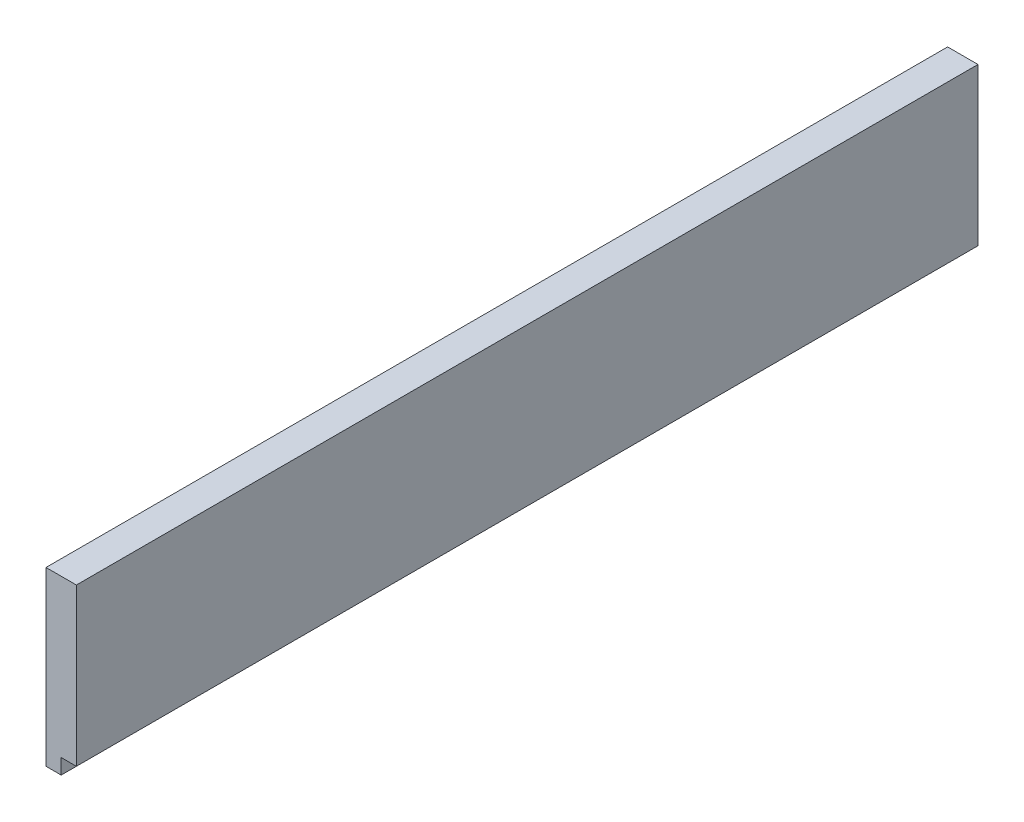
ISO-10303-21;
HEADER;
FILE_DESCRIPTION(('STEP AP214'),'2;1');
FILE_NAME('part.step','',(''),(''),'','','');
FILE_SCHEMA(('AUTOMOTIVE_DESIGN { 1 0 10303 214 1 1 1 1 }'));
ENDSEC;
DATA;
#1=APPLICATION_CONTEXT('core data for automotive mechanical design processes');
#2=APPLICATION_PROTOCOL_DEFINITION('international standard','automotive_design',2000,#1);
#3=PRODUCT_CONTEXT('',#1,'mechanical');
#4=PRODUCT('Part','Part','',(#3));
#5=PRODUCT_RELATED_PRODUCT_CATEGORY('part','',(#4));
#6=PRODUCT_DEFINITION_FORMATION('','',#4);
#7=PRODUCT_DEFINITION_CONTEXT('part definition',#1,'design');
#8=PRODUCT_DEFINITION('design','',#6,#7);
#9=PRODUCT_DEFINITION_SHAPE('','',#8);
#10=(LENGTH_UNIT() NAMED_UNIT(*) SI_UNIT(.MILLI.,.METRE.));
#11=(NAMED_UNIT(*) PLANE_ANGLE_UNIT() SI_UNIT($,.RADIAN.));
#12=(NAMED_UNIT(*) SI_UNIT($,.STERADIAN.) SOLID_ANGLE_UNIT());
#13=UNCERTAINTY_MEASURE_WITH_UNIT(LENGTH_MEASURE(1.E-05),#10,'distance_accuracy_value','');
#14=(GEOMETRIC_REPRESENTATION_CONTEXT(3) GLOBAL_UNCERTAINTY_ASSIGNED_CONTEXT((#13)) GLOBAL_UNIT_ASSIGNED_CONTEXT((#10,
#11,#12)) REPRESENTATION_CONTEXT('',''));
#15=CARTESIAN_POINT('',(0.,0.,0.));
#16=DIRECTION('',(0.,0.,1.));
#17=DIRECTION('',(1.,0.,0.));
#18=AXIS2_PLACEMENT_3D('',#15,#16,#17);
#19=CARTESIAN_POINT('',(0.,170.,890.));
#20=DIRECTION('',(1.,0.,0.));
#21=DIRECTION('',(0.,0.,-1.));
#22=AXIS2_PLACEMENT_3D('',#19,#20,#21);
#23=PLANE('',#22);
#24=DIRECTION('',(0.,-1.,0.));
#25=VECTOR('',#24,1.);
#26=CARTESIAN_POINT('',(0.,170.,0.));
#27=LINE('',#26,#25);
#28=CARTESIAN_POINT('',(0.,170.,0.));
#29=VERTEX_POINT('',#28);
#30=CARTESIAN_POINT('',(0.,0.,0.));
#31=VERTEX_POINT('',#30);
#32=EDGE_CURVE('E119',#29,#31,#27,.T.);
#33=ORIENTED_EDGE('',*,*,#32,.T.);
#34=DIRECTION('',(0.,0.,-1.));
#35=VECTOR('',#34,1.);
#36=CARTESIAN_POINT('',(0.,0.,890.));
#37=LINE('',#36,#35);
#38=CARTESIAN_POINT('',(0.,0.,890.));
#39=VERTEX_POINT('',#38);
#40=EDGE_CURVE('E11',#39,#31,#37,.T.);
#41=ORIENTED_EDGE('',*,*,#40,.F.);
#42=DIRECTION('',(0.,-1.,0.));
#43=VECTOR('',#42,1.);
#44=CARTESIAN_POINT('',(0.,170.,890.));
#45=LINE('',#44,#43);
#46=CARTESIAN_POINT('',(0.,170.,890.));
#47=VERTEX_POINT('',#46);
#48=EDGE_CURVE('E129',#47,#39,#45,.T.);
#49=ORIENTED_EDGE('',*,*,#48,.F.);
#50=DIRECTION('',(0.,0.,-1.));
#51=VECTOR('',#50,1.);
#52=CARTESIAN_POINT('',(0.,170.,890.));
#53=LINE('',#52,#51);
#54=EDGE_CURVE('E115',#47,#29,#53,.T.);
#55=ORIENTED_EDGE('',*,*,#54,.T.);
#56=EDGE_LOOP('',(#33,#41,#49,#55));
#57=FACE_BOUND('',#56,.T.);
#58=ADVANCED_FACE('F35',(#57),#23,.F.);
#59=CARTESIAN_POINT('',(0.,0.,890.));
#60=DIRECTION('',(0.,1.,0.));
#61=DIRECTION('',(0.,0.,1.));
#62=AXIS2_PLACEMENT_3D('',#59,#60,#61);
#63=PLANE('',#62);
#64=DIRECTION('',(1.,0.,0.));
#65=VECTOR('',#64,1.);
#66=CARTESIAN_POINT('',(0.,0.,0.));
#67=LINE('',#66,#65);
#68=CARTESIAN_POINT('',(15.,0.,0.));
#69=VERTEX_POINT('',#68);
#70=EDGE_CURVE('E122',#31,#69,#67,.T.);
#71=ORIENTED_EDGE('',*,*,#70,.T.);
#72=DIRECTION('',(0.,0.,-1.));
#73=VECTOR('',#72,1.);
#74=CARTESIAN_POINT('',(15.,0.,890.));
#75=LINE('',#74,#73);
#76=CARTESIAN_POINT('',(15.,0.,890.));
#77=VERTEX_POINT('',#76);
#78=EDGE_CURVE('E43',#77,#69,#75,.T.);
#79=ORIENTED_EDGE('',*,*,#78,.F.);
#80=DIRECTION('',(1.,0.,0.));
#81=VECTOR('',#80,1.);
#82=CARTESIAN_POINT('',(0.,0.,890.));
#83=LINE('',#82,#81);
#84=EDGE_CURVE('E88',#39,#77,#83,.T.);
#85=ORIENTED_EDGE('',*,*,#84,.F.);
#86=ORIENTED_EDGE('',*,*,#40,.T.);
#87=EDGE_LOOP('',(#71,#79,#85,#86));
#88=FACE_BOUND('',#87,.T.);
#89=ADVANCED_FACE('F153',(#88),#63,.F.);
#90=CARTESIAN_POINT('',(15.,0.,890.));
#91=DIRECTION('',(-1.,0.,0.));
#92=DIRECTION('',(0.,0.,1.));
#93=AXIS2_PLACEMENT_3D('',#90,#91,#92);
#94=PLANE('',#93);
#95=DIRECTION('',(0.,1.,0.));
#96=VECTOR('',#95,1.);
#97=CARTESIAN_POINT('',(15.,0.,0.));
#98=LINE('',#97,#96);
#99=CARTESIAN_POINT('',(15.,15.,0.));
#100=VERTEX_POINT('',#99);
#101=EDGE_CURVE('E124',#69,#100,#98,.T.);
#102=ORIENTED_EDGE('',*,*,#101,.T.);
#103=DIRECTION('',(0.,0.,-1.));
#104=VECTOR('',#103,1.);
#105=CARTESIAN_POINT('',(15.,15.,890.));
#106=LINE('',#105,#104);
#107=CARTESIAN_POINT('',(15.,15.,890.));
#108=VERTEX_POINT('',#107);
#109=EDGE_CURVE('E110',#108,#100,#106,.T.);
#110=ORIENTED_EDGE('',*,*,#109,.F.);
#111=DIRECTION('',(0.,1.,0.));
#112=VECTOR('',#111,1.);
#113=CARTESIAN_POINT('',(15.,0.,890.));
#114=LINE('',#113,#112);
#115=EDGE_CURVE('E101',#77,#108,#114,.T.);
#116=ORIENTED_EDGE('',*,*,#115,.F.);
#117=ORIENTED_EDGE('',*,*,#78,.T.);
#118=EDGE_LOOP('',(#102,#110,#116,#117));
#119=FACE_BOUND('',#118,.T.);
#120=ADVANCED_FACE('F135',(#119),#94,.F.);
#121=CARTESIAN_POINT('',(15.,15.,890.));
#122=DIRECTION('',(0.,1.,0.));
#123=DIRECTION('',(0.,0.,1.));
#124=AXIS2_PLACEMENT_3D('',#121,#122,#123);
#125=PLANE('',#124);
#126=DIRECTION('',(1.,0.,0.));
#127=VECTOR('',#126,1.);
#128=CARTESIAN_POINT('',(15.,15.,0.));
#129=LINE('',#128,#127);
#130=CARTESIAN_POINT('',(30.,15.,0.));
#131=VERTEX_POINT('',#130);
#132=EDGE_CURVE('E109',#100,#131,#129,.T.);
#133=ORIENTED_EDGE('',*,*,#132,.T.);
#134=DIRECTION('',(0.,0.,-1.));
#135=VECTOR('',#134,1.);
#136=CARTESIAN_POINT('',(30.,15.,890.));
#137=LINE('',#136,#135);
#138=CARTESIAN_POINT('',(30.,15.,890.));
#139=VERTEX_POINT('',#138);
#140=EDGE_CURVE('E106',#139,#131,#137,.T.);
#141=ORIENTED_EDGE('',*,*,#140,.F.);
#142=DIRECTION('',(1.,0.,0.));
#143=VECTOR('',#142,1.);
#144=CARTESIAN_POINT('',(15.,15.,890.));
#145=LINE('',#144,#143);
#146=EDGE_CURVE('E95',#108,#139,#145,.T.);
#147=ORIENTED_EDGE('',*,*,#146,.F.);
#148=ORIENTED_EDGE('',*,*,#109,.T.);
#149=EDGE_LOOP('',(#133,#141,#147,#148));
#150=FACE_BOUND('',#149,.T.);
#151=ADVANCED_FACE('F107',(#150),#125,.F.);
#152=CARTESIAN_POINT('',(30.,15.,890.));
#153=DIRECTION('',(-1.,0.,0.));
#154=DIRECTION('',(0.,-1.,0.));
#155=AXIS2_PLACEMENT_3D('',#152,#153,#154);
#156=PLANE('',#155);
#157=DIRECTION('',(0.,1.,0.));
#158=VECTOR('',#157,1.);
#159=CARTESIAN_POINT('',(30.,15.,0.));
#160=LINE('',#159,#158);
#161=CARTESIAN_POINT('',(30.,170.,0.));
#162=VERTEX_POINT('',#161);
#163=EDGE_CURVE('E74',#131,#162,#160,.T.);
#164=ORIENTED_EDGE('',*,*,#163,.T.);
#165=DIRECTION('',(0.,0.,-1.));
#166=VECTOR('',#165,1.);
#167=CARTESIAN_POINT('',(30.,170.,890.));
#168=LINE('',#167,#166);
#169=CARTESIAN_POINT('',(30.,170.,890.));
#170=VERTEX_POINT('',#169);
#171=EDGE_CURVE('E111',#170,#162,#168,.T.);
#172=ORIENTED_EDGE('',*,*,#171,.F.);
#173=DIRECTION('',(0.,1.,0.));
#174=VECTOR('',#173,1.);
#175=CARTESIAN_POINT('',(30.,15.,890.));
#176=LINE('',#175,#174);
#177=EDGE_CURVE('E99',#139,#170,#176,.T.);
#178=ORIENTED_EDGE('',*,*,#177,.F.);
#179=ORIENTED_EDGE('',*,*,#140,.T.);
#180=EDGE_LOOP('',(#164,#172,#178,#179));
#181=FACE_BOUND('',#180,.T.);
#182=ADVANCED_FACE('F113',(#181),#156,.F.);
#183=CARTESIAN_POINT('',(30.,170.,890.));
#184=DIRECTION('',(0.,-1.,0.));
#185=DIRECTION('',(0.,0.,-1.));
#186=AXIS2_PLACEMENT_3D('',#183,#184,#185);
#187=PLANE('',#186);
#188=DIRECTION('',(-1.,0.,0.));
#189=VECTOR('',#188,1.);
#190=CARTESIAN_POINT('',(30.,170.,0.));
#191=LINE('',#190,#189);
#192=EDGE_CURVE('E80',#162,#29,#191,.T.);
#193=ORIENTED_EDGE('',*,*,#192,.T.);
#194=ORIENTED_EDGE('',*,*,#54,.F.);
#195=DIRECTION('',(-1.,0.,0.));
#196=VECTOR('',#195,1.);
#197=CARTESIAN_POINT('',(30.,170.,890.));
#198=LINE('',#197,#196);
#199=EDGE_CURVE('E51',#170,#47,#198,.T.);
#200=ORIENTED_EDGE('',*,*,#199,.F.);
#201=ORIENTED_EDGE('',*,*,#171,.T.);
#202=EDGE_LOOP('',(#193,#194,#200,#201));
#203=FACE_BOUND('',#202,.T.);
#204=ADVANCED_FACE('F142',(#203),#187,.F.);
#205=CARTESIAN_POINT('',(0.,0.,890.));
#206=DIRECTION('',(0.,0.,1.));
#207=DIRECTION('',(1.,0.,0.));
#208=AXIS2_PLACEMENT_3D('',#205,#206,#207);
#209=PLANE('',#208);
#210=ORIENTED_EDGE('',*,*,#48,.T.);
#211=ORIENTED_EDGE('',*,*,#84,.T.);
#212=ORIENTED_EDGE('',*,*,#115,.T.);
#213=ORIENTED_EDGE('',*,*,#146,.T.);
#214=ORIENTED_EDGE('',*,*,#177,.T.);
#215=ORIENTED_EDGE('',*,*,#199,.T.);
#216=EDGE_LOOP('',(#210,#211,#212,#213,#214,#215));
#217=FACE_BOUND('',#216,.T.);
#218=ADVANCED_FACE('F97',(#217),#209,.T.);
#219=CARTESIAN_POINT('',(0.,0.,0.));
#220=DIRECTION('',(0.,0.,1.));
#221=DIRECTION('',(1.,0.,0.));
#222=AXIS2_PLACEMENT_3D('',#219,#220,#221);
#223=PLANE('',#222);
#224=ORIENTED_EDGE('',*,*,#32,.F.);
#225=ORIENTED_EDGE('',*,*,#192,.F.);
#226=ORIENTED_EDGE('',*,*,#163,.F.);
#227=ORIENTED_EDGE('',*,*,#132,.F.);
#228=ORIENTED_EDGE('',*,*,#101,.F.);
#229=ORIENTED_EDGE('',*,*,#70,.F.);
#230=EDGE_LOOP('',(#224,#225,#226,#227,#228,#229));
#231=FACE_BOUND('',#230,.T.);
#232=ADVANCED_FACE('F138',(#231),#223,.F.);
#233=CLOSED_SHELL('',(#58,#89,#120,#151,#182,#204,#218,#232));
#234=MANIFOLD_SOLID_BREP('B2',#233);
#235=ADVANCED_BREP_SHAPE_REPRESENTATION('',(#18,#234),#14);
#236=SHAPE_DEFINITION_REPRESENTATION(#9,#235);
ENDSEC;
END-ISO-10303-21;
